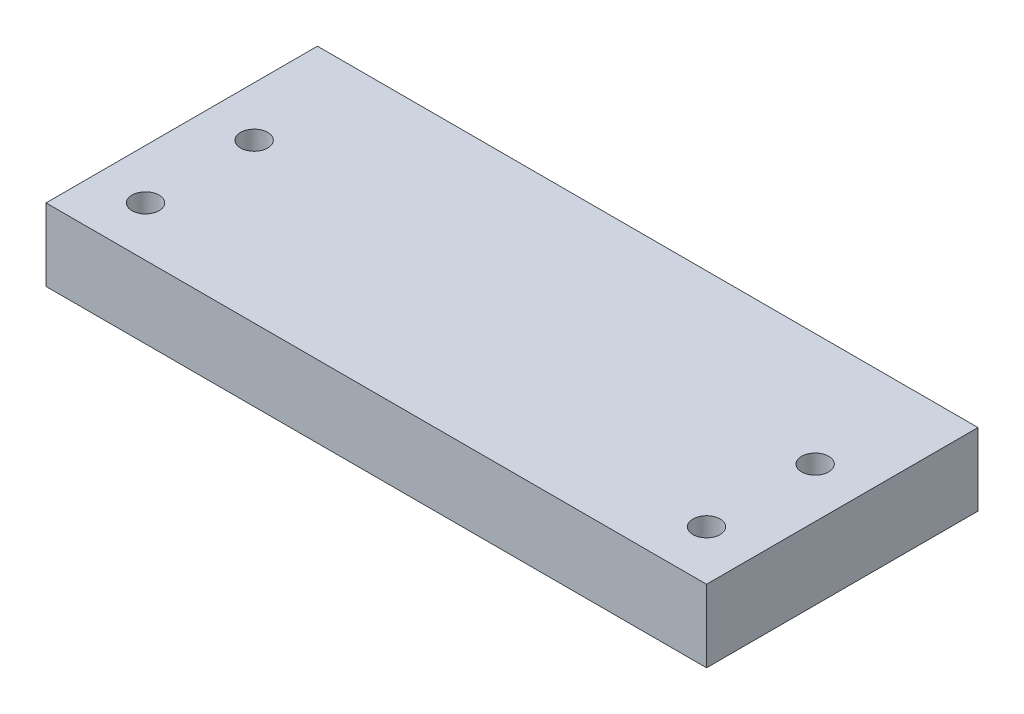
ISO-10303-21;
HEADER;
FILE_DESCRIPTION(('STEP AP214'),'2;1');
FILE_NAME('part.step','',(''),(''),'','','');
FILE_SCHEMA(('AUTOMOTIVE_DESIGN { 1 0 10303 214 1 1 1 1 }'));
ENDSEC;
DATA;
#1=APPLICATION_CONTEXT('core data for automotive mechanical design processes');
#2=APPLICATION_PROTOCOL_DEFINITION('international standard','automotive_design',2000,#1);
#3=PRODUCT_CONTEXT('',#1,'mechanical');
#4=PRODUCT('Part','Part','',(#3));
#5=PRODUCT_RELATED_PRODUCT_CATEGORY('part','',(#4));
#6=PRODUCT_DEFINITION_FORMATION('','',#4);
#7=PRODUCT_DEFINITION_CONTEXT('part definition',#1,'design');
#8=PRODUCT_DEFINITION('design','',#6,#7);
#9=PRODUCT_DEFINITION_SHAPE('','',#8);
#10=(LENGTH_UNIT() NAMED_UNIT(*) SI_UNIT(.MILLI.,.METRE.));
#11=(NAMED_UNIT(*) PLANE_ANGLE_UNIT() SI_UNIT($,.RADIAN.));
#12=(NAMED_UNIT(*) SI_UNIT($,.STERADIAN.) SOLID_ANGLE_UNIT());
#13=UNCERTAINTY_MEASURE_WITH_UNIT(LENGTH_MEASURE(1.E-05),#10,'distance_accuracy_value','');
#14=(GEOMETRIC_REPRESENTATION_CONTEXT(3) GLOBAL_UNCERTAINTY_ASSIGNED_CONTEXT((#13)) GLOBAL_UNIT_ASSIGNED_CONTEXT((#10,
#11,#12)) REPRESENTATION_CONTEXT('',''));
#15=CARTESIAN_POINT('',(0.,0.,0.));
#16=DIRECTION('',(0.,0.,1.));
#17=DIRECTION('',(1.,0.,0.));
#18=AXIS2_PLACEMENT_3D('',#15,#16,#17);
#19=CARTESIAN_POINT('',(36.5,8.,15.));
#20=DIRECTION('',(-1.,0.,0.));
#21=DIRECTION('',(0.,0.,1.));
#22=AXIS2_PLACEMENT_3D('',#19,#20,#21);
#23=PLANE('',#22);
#24=DIRECTION('',(0.,0.,-1.));
#25=VECTOR('',#24,1.);
#26=CARTESIAN_POINT('',(36.5,0.,15.));
#27=LINE('',#26,#25);
#28=CARTESIAN_POINT('',(36.5,0.,15.));
#29=VERTEX_POINT('',#28);
#30=CARTESIAN_POINT('',(36.5,0.,-15.));
#31=VERTEX_POINT('',#30);
#32=EDGE_CURVE('E100',#29,#31,#27,.T.);
#33=ORIENTED_EDGE('',*,*,#32,.T.);
#34=DIRECTION('',(0.,-1.,0.));
#35=VECTOR('',#34,1.);
#36=CARTESIAN_POINT('',(36.5,8.,-15.));
#37=LINE('',#36,#35);
#38=CARTESIAN_POINT('',(36.5,8.,-15.));
#39=VERTEX_POINT('',#38);
#40=EDGE_CURVE('E11',#39,#31,#37,.T.);
#41=ORIENTED_EDGE('',*,*,#40,.F.);
#42=DIRECTION('',(0.,0.,-1.));
#43=VECTOR('',#42,1.);
#44=CARTESIAN_POINT('',(36.5,8.,15.));
#45=LINE('',#44,#43);
#46=CARTESIAN_POINT('',(36.5,8.,15.));
#47=VERTEX_POINT('',#46);
#48=EDGE_CURVE('E87',#47,#39,#45,.T.);
#49=ORIENTED_EDGE('',*,*,#48,.F.);
#50=DIRECTION('',(0.,-1.,0.));
#51=VECTOR('',#50,1.);
#52=CARTESIAN_POINT('',(36.5,8.,15.));
#53=LINE('',#52,#51);
#54=EDGE_CURVE('E96',#47,#29,#53,.T.);
#55=ORIENTED_EDGE('',*,*,#54,.T.);
#56=EDGE_LOOP('',(#33,#41,#49,#55));
#57=FACE_BOUND('',#56,.T.);
#58=ADVANCED_FACE('F34',(#57),#23,.F.);
#59=CARTESIAN_POINT('',(-36.5,8.,-15.));
#60=DIRECTION('',(0.,0.,1.));
#61=DIRECTION('',(1.,0.,0.));
#62=AXIS2_PLACEMENT_3D('',#59,#60,#61);
#63=PLANE('',#62);
#64=DIRECTION('',(-1.,0.,0.));
#65=VECTOR('',#64,1.);
#66=CARTESIAN_POINT('',(-36.5,0.,-15.));
#67=LINE('',#66,#65);
#68=CARTESIAN_POINT('',(-36.5,0.,-15.));
#69=VERTEX_POINT('',#68);
#70=EDGE_CURVE('E91',#31,#69,#67,.T.);
#71=ORIENTED_EDGE('',*,*,#70,.T.);
#72=DIRECTION('',(0.,-1.,0.));
#73=VECTOR('',#72,1.);
#74=CARTESIAN_POINT('',(-36.5,8.,-15.));
#75=LINE('',#74,#73);
#76=CARTESIAN_POINT('',(-36.5,8.,-15.));
#77=VERTEX_POINT('',#76);
#78=EDGE_CURVE('E43',#77,#69,#75,.T.);
#79=ORIENTED_EDGE('',*,*,#78,.F.);
#80=DIRECTION('',(-1.,0.,0.));
#81=VECTOR('',#80,1.);
#82=CARTESIAN_POINT('',(-36.5,8.,-15.));
#83=LINE('',#82,#81);
#84=EDGE_CURVE('E82',#39,#77,#83,.T.);
#85=ORIENTED_EDGE('',*,*,#84,.F.);
#86=ORIENTED_EDGE('',*,*,#40,.T.);
#87=EDGE_LOOP('',(#71,#79,#85,#86));
#88=FACE_BOUND('',#87,.T.);
#89=ADVANCED_FACE('F90',(#88),#63,.F.);
#90=CARTESIAN_POINT('',(-36.5,8.,15.));
#91=DIRECTION('',(1.,0.,0.));
#92=DIRECTION('',(0.,0.,-1.));
#93=AXIS2_PLACEMENT_3D('',#90,#91,#92);
#94=PLANE('',#93);
#95=DIRECTION('',(0.,0.,1.));
#96=VECTOR('',#95,1.);
#97=CARTESIAN_POINT('',(-36.5,0.,15.));
#98=LINE('',#97,#96);
#99=CARTESIAN_POINT('',(-36.5,0.,15.));
#100=VERTEX_POINT('',#99);
#101=EDGE_CURVE('E69',#69,#100,#98,.T.);
#102=ORIENTED_EDGE('',*,*,#101,.T.);
#103=DIRECTION('',(0.,-1.,0.));
#104=VECTOR('',#103,1.);
#105=CARTESIAN_POINT('',(-36.5,8.,15.));
#106=LINE('',#105,#104);
#107=CARTESIAN_POINT('',(-36.5,8.,15.));
#108=VERTEX_POINT('',#107);
#109=EDGE_CURVE('E92',#108,#100,#106,.T.);
#110=ORIENTED_EDGE('',*,*,#109,.F.);
#111=DIRECTION('',(0.,0.,1.));
#112=VECTOR('',#111,1.);
#113=CARTESIAN_POINT('',(-36.5,8.,15.));
#114=LINE('',#113,#112);
#115=EDGE_CURVE('E85',#77,#108,#114,.T.);
#116=ORIENTED_EDGE('',*,*,#115,.F.);
#117=ORIENTED_EDGE('',*,*,#78,.T.);
#118=EDGE_LOOP('',(#102,#110,#116,#117));
#119=FACE_BOUND('',#118,.T.);
#120=ADVANCED_FACE('F94',(#119),#94,.F.);
#121=CARTESIAN_POINT('',(-36.5,8.,15.));
#122=DIRECTION('',(0.,0.,-1.));
#123=DIRECTION('',(-1.,0.,0.));
#124=AXIS2_PLACEMENT_3D('',#121,#122,#123);
#125=PLANE('',#124);
#126=DIRECTION('',(1.,0.,0.));
#127=VECTOR('',#126,1.);
#128=CARTESIAN_POINT('',(-36.5,0.,15.));
#129=LINE('',#128,#127);
#130=EDGE_CURVE('E75',#100,#29,#129,.T.);
#131=ORIENTED_EDGE('',*,*,#130,.T.);
#132=ORIENTED_EDGE('',*,*,#54,.F.);
#133=DIRECTION('',(1.,0.,0.));
#134=VECTOR('',#133,1.);
#135=CARTESIAN_POINT('',(-36.5,8.,15.));
#136=LINE('',#135,#134);
#137=EDGE_CURVE('E52',#108,#47,#136,.T.);
#138=ORIENTED_EDGE('',*,*,#137,.F.);
#139=ORIENTED_EDGE('',*,*,#109,.T.);
#140=EDGE_LOOP('',(#131,#132,#138,#139));
#141=FACE_BOUND('',#140,.T.);
#142=ADVANCED_FACE('F150',(#141),#125,.F.);
#143=CARTESIAN_POINT('',(0.,8.,0.));
#144=DIRECTION('',(0.,-1.,0.));
#145=DIRECTION('',(0.,0.,-1.));
#146=AXIS2_PLACEMENT_3D('',#143,#144,#145);
#147=PLANE('',#146);
#148=CARTESIAN_POINT('',(31.,8.,9.49999999999999));
#149=DIRECTION('',(0.,-1.,0.));
#150=DIRECTION('',(0.,0.,-1.));
#151=AXIS2_PLACEMENT_3D('',#148,#149,#150);
#152=CIRCLE('',#151,1.5);
#153=CARTESIAN_POINT('',(32.5,8.,9.49999999999999));
#154=VERTEX_POINT('',#153);
#155=EDGE_CURVE('E103',#154,#154,#152,.T.);
#156=ORIENTED_EDGE('',*,*,#155,.T.);
#157=EDGE_LOOP('',(#156));
#158=FACE_BOUND('',#157,.T.);
#159=CARTESIAN_POINT('',(-31.,8.,9.5));
#160=DIRECTION('',(0.,-1.,0.));
#161=DIRECTION('',(0.,0.,-1.));
#162=AXIS2_PLACEMENT_3D('',#159,#160,#161);
#163=CIRCLE('',#162,1.5);
#164=CARTESIAN_POINT('',(-29.5,8.,9.5));
#165=VERTEX_POINT('',#164);
#166=EDGE_CURVE('E118',#165,#165,#163,.T.);
#167=ORIENTED_EDGE('',*,*,#166,.T.);
#168=EDGE_LOOP('',(#167));
#169=FACE_BOUND('',#168,.T.);
#170=CARTESIAN_POINT('',(-31.,8.,-2.5));
#171=DIRECTION('',(0.,-1.,0.));
#172=DIRECTION('',(0.,0.,-1.));
#173=AXIS2_PLACEMENT_3D('',#170,#171,#172);
#174=CIRCLE('',#173,1.5);
#175=CARTESIAN_POINT('',(-29.5,8.,-2.5));
#176=VERTEX_POINT('',#175);
#177=EDGE_CURVE('E115',#176,#176,#174,.T.);
#178=ORIENTED_EDGE('',*,*,#177,.T.);
#179=EDGE_LOOP('',(#178));
#180=FACE_BOUND('',#179,.T.);
#181=CARTESIAN_POINT('',(31.,8.,-2.50000000000001));
#182=DIRECTION('',(0.,-1.,0.));
#183=DIRECTION('',(0.,0.,-1.));
#184=AXIS2_PLACEMENT_3D('',#181,#182,#183);
#185=CIRCLE('',#184,1.5);
#186=CARTESIAN_POINT('',(32.5,8.,-2.50000000000001));
#187=VERTEX_POINT('',#186);
#188=EDGE_CURVE('E112',#187,#187,#185,.T.);
#189=ORIENTED_EDGE('',*,*,#188,.T.);
#190=EDGE_LOOP('',(#189));
#191=FACE_BOUND('',#190,.T.);
#192=ORIENTED_EDGE('',*,*,#48,.T.);
#193=ORIENTED_EDGE('',*,*,#84,.T.);
#194=ORIENTED_EDGE('',*,*,#115,.T.);
#195=ORIENTED_EDGE('',*,*,#137,.T.);
#196=EDGE_LOOP('',(#192,#193,#194,#195));
#197=FACE_BOUND('',#196,.T.);
#198=ADVANCED_FACE('F83',(#158,#169,#180,#191,#197),#147,.F.);
#199=CARTESIAN_POINT('',(0.,0.,0.));
#200=DIRECTION('',(0.,-1.,0.));
#201=DIRECTION('',(0.,0.,-1.));
#202=AXIS2_PLACEMENT_3D('',#199,#200,#201);
#203=PLANE('',#202);
#204=CARTESIAN_POINT('',(31.,0.,9.49999999999999));
#205=DIRECTION('',(0.,-1.,0.));
#206=DIRECTION('',(0.,0.,-1.));
#207=AXIS2_PLACEMENT_3D('',#204,#205,#206);
#208=CIRCLE('',#207,1.5);
#209=CARTESIAN_POINT('',(32.5,0.,9.49999999999999));
#210=VERTEX_POINT('',#209);
#211=EDGE_CURVE('E37',#210,#210,#208,.T.);
#212=ORIENTED_EDGE('',*,*,#211,.F.);
#213=EDGE_LOOP('',(#212));
#214=FACE_BOUND('',#213,.T.);
#215=CARTESIAN_POINT('',(-31.,0.,9.5));
#216=DIRECTION('',(0.,-1.,0.));
#217=DIRECTION('',(0.,0.,-1.));
#218=AXIS2_PLACEMENT_3D('',#215,#216,#217);
#219=CIRCLE('',#218,1.5);
#220=CARTESIAN_POINT('',(-29.5,0.,9.5));
#221=VERTEX_POINT('',#220);
#222=EDGE_CURVE('E116',#221,#221,#219,.T.);
#223=ORIENTED_EDGE('',*,*,#222,.F.);
#224=EDGE_LOOP('',(#223));
#225=FACE_BOUND('',#224,.T.);
#226=CARTESIAN_POINT('',(-31.,0.,-2.5));
#227=DIRECTION('',(0.,-1.,0.));
#228=DIRECTION('',(0.,0.,-1.));
#229=AXIS2_PLACEMENT_3D('',#226,#227,#228);
#230=CIRCLE('',#229,1.5);
#231=CARTESIAN_POINT('',(-29.5,0.,-2.5));
#232=VERTEX_POINT('',#231);
#233=EDGE_CURVE('E113',#232,#232,#230,.T.);
#234=ORIENTED_EDGE('',*,*,#233,.F.);
#235=EDGE_LOOP('',(#234));
#236=FACE_BOUND('',#235,.T.);
#237=CARTESIAN_POINT('',(31.,0.,-2.50000000000001));
#238=DIRECTION('',(0.,-1.,0.));
#239=DIRECTION('',(0.,0.,-1.));
#240=AXIS2_PLACEMENT_3D('',#237,#238,#239);
#241=CIRCLE('',#240,1.5);
#242=CARTESIAN_POINT('',(32.5,0.,-2.50000000000001));
#243=VERTEX_POINT('',#242);
#244=EDGE_CURVE('E109',#243,#243,#241,.T.);
#245=ORIENTED_EDGE('',*,*,#244,.F.);
#246=EDGE_LOOP('',(#245));
#247=FACE_BOUND('',#246,.T.);
#248=ORIENTED_EDGE('',*,*,#32,.F.);
#249=ORIENTED_EDGE('',*,*,#130,.F.);
#250=ORIENTED_EDGE('',*,*,#101,.F.);
#251=ORIENTED_EDGE('',*,*,#70,.F.);
#252=EDGE_LOOP('',(#248,#249,#250,#251));
#253=FACE_BOUND('',#252,.T.);
#254=ADVANCED_FACE('F138',(#214,#225,#236,#247,#253),#203,.T.);
#255=CARTESIAN_POINT('',(31.,17.,-2.50000000000001));
#256=DIRECTION('',(0.,-1.,0.));
#257=DIRECTION('',(1.,0.,0.));
#258=AXIS2_PLACEMENT_3D('',#255,#256,#257);
#259=CYLINDRICAL_SURFACE('',#258,1.5);
#260=CARTESIAN_POINT('',(32.5,0.,-2.50000000000001));
#261=CARTESIAN_POINT('',(32.5,0.0833333333333368,-2.50000000000001));
#262=CARTESIAN_POINT('',(32.5,0.16666666666667,-2.50000000000001));
#263=CARTESIAN_POINT('',(32.5,0.333333333333337,-2.50000000000001));
#264=CARTESIAN_POINT('',(32.5,0.416666666666671,-2.50000000000001));
#265=CARTESIAN_POINT('',(32.5,0.583333333333337,-2.50000000000001));
#266=CARTESIAN_POINT('',(32.5,0.666666666666671,-2.50000000000001));
#267=CARTESIAN_POINT('',(32.5,0.833333333333338,-2.50000000000001));
#268=CARTESIAN_POINT('',(32.5,0.916666666666671,-2.50000000000001));
#269=CARTESIAN_POINT('',(32.5,1.08333333333334,-2.50000000000001));
#270=CARTESIAN_POINT('',(32.5,1.16666666666667,-2.50000000000001));
#271=CARTESIAN_POINT('',(32.5,1.33333333333334,-2.50000000000001));
#272=CARTESIAN_POINT('',(32.5,1.41666666666667,-2.50000000000001));
#273=CARTESIAN_POINT('',(32.5,1.58333333333333,-2.50000000000001));
#274=CARTESIAN_POINT('',(32.5,1.66666666666667,-2.50000000000001));
#275=CARTESIAN_POINT('',(32.5,1.83333333333334,-2.50000000000001));
#276=CARTESIAN_POINT('',(32.5,1.91666666666667,-2.50000000000001));
#277=CARTESIAN_POINT('',(32.5,2.08333333333334,-2.50000000000001));
#278=CARTESIAN_POINT('',(32.5,2.16666666666667,-2.50000000000001));
#279=CARTESIAN_POINT('',(32.5,2.33333333333334,-2.50000000000001));
#280=CARTESIAN_POINT('',(32.5,2.41666666666667,-2.50000000000001));
#281=CARTESIAN_POINT('',(32.5,2.58333333333334,-2.50000000000001));
#282=CARTESIAN_POINT('',(32.5,2.66666666666667,-2.50000000000001));
#283=CARTESIAN_POINT('',(32.5,2.83333333333333,-2.50000000000001));
#284=CARTESIAN_POINT('',(32.5,2.91666666666667,-2.50000000000001));
#285=CARTESIAN_POINT('',(32.5,3.08333333333333,-2.50000000000001));
#286=CARTESIAN_POINT('',(32.5,3.16666666666667,-2.50000000000001));
#287=CARTESIAN_POINT('',(32.5,3.33333333333333,-2.50000000000001));
#288=CARTESIAN_POINT('',(32.5,3.41666666666667,-2.50000000000001));
#289=CARTESIAN_POINT('',(32.5,3.58333333333333,-2.50000000000001));
#290=CARTESIAN_POINT('',(32.5,3.66666666666667,-2.50000000000001));
#291=CARTESIAN_POINT('',(32.5,3.83333333333333,-2.50000000000001));
#292=CARTESIAN_POINT('',(32.5,3.91666666666667,-2.50000000000001));
#293=CARTESIAN_POINT('',(32.5,4.08333333333334,-2.50000000000001));
#294=CARTESIAN_POINT('',(32.5,4.16666666666667,-2.50000000000001));
#295=CARTESIAN_POINT('',(32.5,4.33333333333334,-2.50000000000001));
#296=CARTESIAN_POINT('',(32.5,4.41666666666667,-2.50000000000001));
#297=CARTESIAN_POINT('',(32.5,4.58333333333334,-2.50000000000001));
#298=CARTESIAN_POINT('',(32.5,4.66666666666667,-2.50000000000001));
#299=CARTESIAN_POINT('',(32.5,4.83333333333334,-2.50000000000001));
#300=CARTESIAN_POINT('',(32.5,4.91666666666667,-2.50000000000001));
#301=CARTESIAN_POINT('',(32.5,5.08333333333334,-2.50000000000001));
#302=CARTESIAN_POINT('',(32.5,5.16666666666667,-2.50000000000001));
#303=CARTESIAN_POINT('',(32.5,5.33333333333334,-2.50000000000001));
#304=CARTESIAN_POINT('',(32.5,5.41666666666667,-2.50000000000001));
#305=CARTESIAN_POINT('',(32.5,5.58333333333333,-2.50000000000001));
#306=CARTESIAN_POINT('',(32.5,5.66666666666667,-2.50000000000001));
#307=CARTESIAN_POINT('',(32.5,5.83333333333334,-2.50000000000001));
#308=CARTESIAN_POINT('',(32.5,5.91666666666667,-2.50000000000001));
#309=CARTESIAN_POINT('',(32.5,6.08333333333334,-2.50000000000001));
#310=CARTESIAN_POINT('',(32.5,6.16666666666667,-2.50000000000001));
#311=CARTESIAN_POINT('',(32.5,6.33333333333334,-2.50000000000001));
#312=CARTESIAN_POINT('',(32.5,6.41666666666667,-2.50000000000001));
#313=CARTESIAN_POINT('',(32.5,6.58333333333333,-2.50000000000001));
#314=CARTESIAN_POINT('',(32.5,6.66666666666667,-2.50000000000001));
#315=CARTESIAN_POINT('',(32.5,6.83333333333333,-2.50000000000001));
#316=CARTESIAN_POINT('',(32.5,6.91666666666667,-2.50000000000001));
#317=CARTESIAN_POINT('',(32.5,7.08333333333333,-2.50000000000001));
#318=CARTESIAN_POINT('',(32.5,7.16666666666667,-2.50000000000001));
#319=CARTESIAN_POINT('',(32.5,7.33333333333333,-2.50000000000001));
#320=CARTESIAN_POINT('',(32.5,7.41666666666667,-2.50000000000001));
#321=CARTESIAN_POINT('',(32.5,7.58333333333333,-2.50000000000001));
#322=CARTESIAN_POINT('',(32.5,7.66666666666667,-2.50000000000001));
#323=CARTESIAN_POINT('',(32.5,7.83333333333333,-2.50000000000001));
#324=CARTESIAN_POINT('',(32.5,7.91666666666667,-2.50000000000001));
#325=CARTESIAN_POINT('',(32.5,8.,-2.50000000000001));
#326=B_SPLINE_CURVE_WITH_KNOTS('',3,(#260,#261,#262,#263,#264,#265,#266,#267,#268,#269,#270,
#271,#272,#273,#274,#275,#276,#277,#278,#279,#280,#281,#282,#283,#284,#285,#286,#287,#288,#289,
#290,#291,#292,#293,#294,#295,#296,#297,#298,#299,#300,#301,#302,#303,#304,#305,#306,#307,#308,
#309,#310,#311,#312,#313,#314,#315,#316,#317,#318,#319,#320,#321,#322,#323,#324,#325),
.UNSPECIFIED.,.F.,.F.,(4,2,2,2,2,2,2,2,2,2,2,2,2,2,2,2,2,2,2,2,2,2,2,2,2,2,2,2,2,2,2,2,4),(0.,
0.25,0.5,0.750000000000001,1.,1.25,1.5,1.75,2.,2.25,2.5,2.75,3.,3.25,3.5,3.75,4.,4.25,4.5,4.75,
5.,5.25,5.5,5.75,6.,6.25,6.5,6.75,7.,7.25,7.5,7.75,8.),.UNSPECIFIED.);
#327=EDGE_CURVE('BSEAM141',#243,#187,#326,.T.);
#328=ORIENTED_EDGE('',*,*,#244,.T.);
#329=ORIENTED_EDGE('',*,*,#188,.F.);
#330=ORIENTED_EDGE('',*,*,#327,.T.);
#331=ORIENTED_EDGE('',*,*,#327,.F.);
#332=EDGE_LOOP('',(#328,#330,#329,#331));
#333=FACE_BOUND('',#332,.T.);
#334=ADVANCED_FACE('F141',(#333),#259,.F.);
#335=CARTESIAN_POINT('',(-31.,17.,-2.5));
#336=DIRECTION('',(0.,-1.,0.));
#337=DIRECTION('',(1.,0.,0.));
#338=AXIS2_PLACEMENT_3D('',#335,#336,#337);
#339=CYLINDRICAL_SURFACE('',#338,1.5);
#340=CARTESIAN_POINT('',(-29.5,0.,-2.5));
#341=CARTESIAN_POINT('',(-29.5,0.0833333333333368,-2.5));
#342=CARTESIAN_POINT('',(-29.5,0.16666666666667,-2.5));
#343=CARTESIAN_POINT('',(-29.5,0.333333333333337,-2.5));
#344=CARTESIAN_POINT('',(-29.5,0.416666666666671,-2.5));
#345=CARTESIAN_POINT('',(-29.5,0.583333333333337,-2.5));
#346=CARTESIAN_POINT('',(-29.5,0.666666666666671,-2.5));
#347=CARTESIAN_POINT('',(-29.5,0.833333333333338,-2.5));
#348=CARTESIAN_POINT('',(-29.5,0.916666666666671,-2.5));
#349=CARTESIAN_POINT('',(-29.5,1.08333333333334,-2.5));
#350=CARTESIAN_POINT('',(-29.5,1.16666666666667,-2.5));
#351=CARTESIAN_POINT('',(-29.5,1.33333333333334,-2.5));
#352=CARTESIAN_POINT('',(-29.5,1.41666666666667,-2.5));
#353=CARTESIAN_POINT('',(-29.5,1.58333333333333,-2.5));
#354=CARTESIAN_POINT('',(-29.5,1.66666666666667,-2.5));
#355=CARTESIAN_POINT('',(-29.5,1.83333333333334,-2.5));
#356=CARTESIAN_POINT('',(-29.5,1.91666666666667,-2.5));
#357=CARTESIAN_POINT('',(-29.5,2.08333333333334,-2.5));
#358=CARTESIAN_POINT('',(-29.5,2.16666666666667,-2.5));
#359=CARTESIAN_POINT('',(-29.5,2.33333333333334,-2.5));
#360=CARTESIAN_POINT('',(-29.5,2.41666666666667,-2.5));
#361=CARTESIAN_POINT('',(-29.5,2.58333333333334,-2.5));
#362=CARTESIAN_POINT('',(-29.5,2.66666666666667,-2.5));
#363=CARTESIAN_POINT('',(-29.5,2.83333333333333,-2.5));
#364=CARTESIAN_POINT('',(-29.5,2.91666666666667,-2.5));
#365=CARTESIAN_POINT('',(-29.5,3.08333333333333,-2.5));
#366=CARTESIAN_POINT('',(-29.5,3.16666666666667,-2.5));
#367=CARTESIAN_POINT('',(-29.5,3.33333333333333,-2.5));
#368=CARTESIAN_POINT('',(-29.5,3.41666666666667,-2.5));
#369=CARTESIAN_POINT('',(-29.5,3.58333333333333,-2.5));
#370=CARTESIAN_POINT('',(-29.5,3.66666666666667,-2.5));
#371=CARTESIAN_POINT('',(-29.5,3.83333333333333,-2.5));
#372=CARTESIAN_POINT('',(-29.5,3.91666666666667,-2.5));
#373=CARTESIAN_POINT('',(-29.5,4.08333333333334,-2.5));
#374=CARTESIAN_POINT('',(-29.5,4.16666666666667,-2.5));
#375=CARTESIAN_POINT('',(-29.5,4.33333333333334,-2.5));
#376=CARTESIAN_POINT('',(-29.5,4.41666666666667,-2.5));
#377=CARTESIAN_POINT('',(-29.5,4.58333333333334,-2.5));
#378=CARTESIAN_POINT('',(-29.5,4.66666666666667,-2.5));
#379=CARTESIAN_POINT('',(-29.5,4.83333333333334,-2.5));
#380=CARTESIAN_POINT('',(-29.5,4.91666666666667,-2.5));
#381=CARTESIAN_POINT('',(-29.5,5.08333333333334,-2.5));
#382=CARTESIAN_POINT('',(-29.5,5.16666666666667,-2.5));
#383=CARTESIAN_POINT('',(-29.5,5.33333333333334,-2.5));
#384=CARTESIAN_POINT('',(-29.5,5.41666666666667,-2.5));
#385=CARTESIAN_POINT('',(-29.5,5.58333333333333,-2.5));
#386=CARTESIAN_POINT('',(-29.5,5.66666666666667,-2.5));
#387=CARTESIAN_POINT('',(-29.5,5.83333333333334,-2.5));
#388=CARTESIAN_POINT('',(-29.5,5.91666666666667,-2.5));
#389=CARTESIAN_POINT('',(-29.5,6.08333333333334,-2.5));
#390=CARTESIAN_POINT('',(-29.5,6.16666666666667,-2.5));
#391=CARTESIAN_POINT('',(-29.5,6.33333333333334,-2.5));
#392=CARTESIAN_POINT('',(-29.5,6.41666666666667,-2.5));
#393=CARTESIAN_POINT('',(-29.5,6.58333333333333,-2.5));
#394=CARTESIAN_POINT('',(-29.5,6.66666666666667,-2.5));
#395=CARTESIAN_POINT('',(-29.5,6.83333333333333,-2.5));
#396=CARTESIAN_POINT('',(-29.5,6.91666666666667,-2.5));
#397=CARTESIAN_POINT('',(-29.5,7.08333333333333,-2.5));
#398=CARTESIAN_POINT('',(-29.5,7.16666666666667,-2.5));
#399=CARTESIAN_POINT('',(-29.5,7.33333333333333,-2.5));
#400=CARTESIAN_POINT('',(-29.5,7.41666666666667,-2.5));
#401=CARTESIAN_POINT('',(-29.5,7.58333333333333,-2.5));
#402=CARTESIAN_POINT('',(-29.5,7.66666666666667,-2.5));
#403=CARTESIAN_POINT('',(-29.5,7.83333333333333,-2.5));
#404=CARTESIAN_POINT('',(-29.5,7.91666666666667,-2.5));
#405=CARTESIAN_POINT('',(-29.5,8.,-2.5));
#406=B_SPLINE_CURVE_WITH_KNOTS('',3,(#340,#341,#342,#343,#344,#345,#346,#347,#348,#349,#350,
#351,#352,#353,#354,#355,#356,#357,#358,#359,#360,#361,#362,#363,#364,#365,#366,#367,#368,#369,
#370,#371,#372,#373,#374,#375,#376,#377,#378,#379,#380,#381,#382,#383,#384,#385,#386,#387,#388,
#389,#390,#391,#392,#393,#394,#395,#396,#397,#398,#399,#400,#401,#402,#403,#404,#405),
.UNSPECIFIED.,.F.,.F.,(4,2,2,2,2,2,2,2,2,2,2,2,2,2,2,2,2,2,2,2,2,2,2,2,2,2,2,2,2,2,2,2,4),(0.,
0.25,0.5,0.750000000000001,1.,1.25,1.5,1.75,2.,2.25,2.5,2.75,3.,3.25,3.5,3.75,4.,4.25,4.5,4.75,
5.,5.25,5.5,5.75,6.,6.25,6.5,6.75,7.,7.25,7.5,7.75,8.),.UNSPECIFIED.);
#407=EDGE_CURVE('BSEAM194',#232,#176,#406,.T.);
#408=ORIENTED_EDGE('',*,*,#233,.T.);
#409=ORIENTED_EDGE('',*,*,#177,.F.);
#410=ORIENTED_EDGE('',*,*,#407,.T.);
#411=ORIENTED_EDGE('',*,*,#407,.F.);
#412=EDGE_LOOP('',(#408,#410,#409,#411));
#413=FACE_BOUND('',#412,.T.);
#414=ADVANCED_FACE('F194',(#413),#339,.F.);
#415=CARTESIAN_POINT('',(-31.,17.,9.5));
#416=DIRECTION('',(0.,-1.,0.));
#417=DIRECTION('',(1.,0.,0.));
#418=AXIS2_PLACEMENT_3D('',#415,#416,#417);
#419=CYLINDRICAL_SURFACE('',#418,1.5);
#420=CARTESIAN_POINT('',(-29.5,0.,9.5));
#421=CARTESIAN_POINT('',(-29.5,0.0833333333333368,9.5));
#422=CARTESIAN_POINT('',(-29.5,0.16666666666667,9.5));
#423=CARTESIAN_POINT('',(-29.5,0.333333333333337,9.5));
#424=CARTESIAN_POINT('',(-29.5,0.416666666666671,9.5));
#425=CARTESIAN_POINT('',(-29.5,0.583333333333337,9.5));
#426=CARTESIAN_POINT('',(-29.5,0.666666666666671,9.5));
#427=CARTESIAN_POINT('',(-29.5,0.833333333333338,9.5));
#428=CARTESIAN_POINT('',(-29.5,0.916666666666671,9.5));
#429=CARTESIAN_POINT('',(-29.5,1.08333333333334,9.5));
#430=CARTESIAN_POINT('',(-29.5,1.16666666666667,9.5));
#431=CARTESIAN_POINT('',(-29.5,1.33333333333334,9.5));
#432=CARTESIAN_POINT('',(-29.5,1.41666666666667,9.5));
#433=CARTESIAN_POINT('',(-29.5,1.58333333333333,9.5));
#434=CARTESIAN_POINT('',(-29.5,1.66666666666667,9.5));
#435=CARTESIAN_POINT('',(-29.5,1.83333333333334,9.5));
#436=CARTESIAN_POINT('',(-29.5,1.91666666666667,9.5));
#437=CARTESIAN_POINT('',(-29.5,2.08333333333334,9.5));
#438=CARTESIAN_POINT('',(-29.5,2.16666666666667,9.5));
#439=CARTESIAN_POINT('',(-29.5,2.33333333333334,9.5));
#440=CARTESIAN_POINT('',(-29.5,2.41666666666667,9.5));
#441=CARTESIAN_POINT('',(-29.5,2.58333333333334,9.5));
#442=CARTESIAN_POINT('',(-29.5,2.66666666666667,9.5));
#443=CARTESIAN_POINT('',(-29.5,2.83333333333333,9.5));
#444=CARTESIAN_POINT('',(-29.5,2.91666666666667,9.5));
#445=CARTESIAN_POINT('',(-29.5,3.08333333333333,9.5));
#446=CARTESIAN_POINT('',(-29.5,3.16666666666667,9.5));
#447=CARTESIAN_POINT('',(-29.5,3.33333333333333,9.5));
#448=CARTESIAN_POINT('',(-29.5,3.41666666666667,9.5));
#449=CARTESIAN_POINT('',(-29.5,3.58333333333333,9.5));
#450=CARTESIAN_POINT('',(-29.5,3.66666666666667,9.5));
#451=CARTESIAN_POINT('',(-29.5,3.83333333333333,9.5));
#452=CARTESIAN_POINT('',(-29.5,3.91666666666667,9.5));
#453=CARTESIAN_POINT('',(-29.5,4.08333333333334,9.5));
#454=CARTESIAN_POINT('',(-29.5,4.16666666666667,9.5));
#455=CARTESIAN_POINT('',(-29.5,4.33333333333334,9.5));
#456=CARTESIAN_POINT('',(-29.5,4.41666666666667,9.5));
#457=CARTESIAN_POINT('',(-29.5,4.58333333333334,9.5));
#458=CARTESIAN_POINT('',(-29.5,4.66666666666667,9.5));
#459=CARTESIAN_POINT('',(-29.5,4.83333333333334,9.5));
#460=CARTESIAN_POINT('',(-29.5,4.91666666666667,9.5));
#461=CARTESIAN_POINT('',(-29.5,5.08333333333334,9.5));
#462=CARTESIAN_POINT('',(-29.5,5.16666666666667,9.5));
#463=CARTESIAN_POINT('',(-29.5,5.33333333333334,9.5));
#464=CARTESIAN_POINT('',(-29.5,5.41666666666667,9.5));
#465=CARTESIAN_POINT('',(-29.5,5.58333333333333,9.5));
#466=CARTESIAN_POINT('',(-29.5,5.66666666666667,9.5));
#467=CARTESIAN_POINT('',(-29.5,5.83333333333334,9.5));
#468=CARTESIAN_POINT('',(-29.5,5.91666666666667,9.5));
#469=CARTESIAN_POINT('',(-29.5,6.08333333333334,9.5));
#470=CARTESIAN_POINT('',(-29.5,6.16666666666667,9.5));
#471=CARTESIAN_POINT('',(-29.5,6.33333333333334,9.5));
#472=CARTESIAN_POINT('',(-29.5,6.41666666666667,9.5));
#473=CARTESIAN_POINT('',(-29.5,6.58333333333333,9.5));
#474=CARTESIAN_POINT('',(-29.5,6.66666666666667,9.5));
#475=CARTESIAN_POINT('',(-29.5,6.83333333333333,9.5));
#476=CARTESIAN_POINT('',(-29.5,6.91666666666667,9.5));
#477=CARTESIAN_POINT('',(-29.5,7.08333333333333,9.5));
#478=CARTESIAN_POINT('',(-29.5,7.16666666666667,9.5));
#479=CARTESIAN_POINT('',(-29.5,7.33333333333333,9.5));
#480=CARTESIAN_POINT('',(-29.5,7.41666666666667,9.5));
#481=CARTESIAN_POINT('',(-29.5,7.58333333333333,9.5));
#482=CARTESIAN_POINT('',(-29.5,7.66666666666667,9.5));
#483=CARTESIAN_POINT('',(-29.5,7.83333333333333,9.5));
#484=CARTESIAN_POINT('',(-29.5,7.91666666666667,9.5));
#485=CARTESIAN_POINT('',(-29.5,8.,9.5));
#486=B_SPLINE_CURVE_WITH_KNOTS('',3,(#420,#421,#422,#423,#424,#425,#426,#427,#428,#429,#430,
#431,#432,#433,#434,#435,#436,#437,#438,#439,#440,#441,#442,#443,#444,#445,#446,#447,#448,#449,
#450,#451,#452,#453,#454,#455,#456,#457,#458,#459,#460,#461,#462,#463,#464,#465,#466,#467,#468,
#469,#470,#471,#472,#473,#474,#475,#476,#477,#478,#479,#480,#481,#482,#483,#484,#485),
.UNSPECIFIED.,.F.,.F.,(4,2,2,2,2,2,2,2,2,2,2,2,2,2,2,2,2,2,2,2,2,2,2,2,2,2,2,2,2,2,2,2,4),(0.,
0.25,0.5,0.750000000000001,1.,1.25,1.5,1.75,2.,2.25,2.5,2.75,3.,3.25,3.5,3.75,4.,4.25,4.5,4.75,
5.,5.25,5.5,5.75,6.,6.25,6.5,6.75,7.,7.25,7.5,7.75,8.),.UNSPECIFIED.);
#487=EDGE_CURVE('BSEAM204',#221,#165,#486,.T.);
#488=ORIENTED_EDGE('',*,*,#222,.T.);
#489=ORIENTED_EDGE('',*,*,#166,.F.);
#490=ORIENTED_EDGE('',*,*,#487,.T.);
#491=ORIENTED_EDGE('',*,*,#487,.F.);
#492=EDGE_LOOP('',(#488,#490,#489,#491));
#493=FACE_BOUND('',#492,.T.);
#494=ADVANCED_FACE('F204',(#493),#419,.F.);
#495=CARTESIAN_POINT('',(31.,17.,9.49999999999999));
#496=DIRECTION('',(0.,-1.,0.));
#497=DIRECTION('',(1.,0.,0.));
#498=AXIS2_PLACEMENT_3D('',#495,#496,#497);
#499=CYLINDRICAL_SURFACE('',#498,1.5);
#500=CARTESIAN_POINT('',(32.5,0.,9.49999999999999));
#501=CARTESIAN_POINT('',(32.5,0.0833333333333368,9.49999999999999));
#502=CARTESIAN_POINT('',(32.5,0.16666666666667,9.49999999999999));
#503=CARTESIAN_POINT('',(32.5,0.333333333333337,9.49999999999999));
#504=CARTESIAN_POINT('',(32.5,0.416666666666671,9.49999999999999));
#505=CARTESIAN_POINT('',(32.5,0.583333333333337,9.49999999999999));
#506=CARTESIAN_POINT('',(32.5,0.666666666666671,9.49999999999999));
#507=CARTESIAN_POINT('',(32.5,0.833333333333338,9.49999999999999));
#508=CARTESIAN_POINT('',(32.5,0.916666666666671,9.49999999999999));
#509=CARTESIAN_POINT('',(32.5,1.08333333333334,9.49999999999999));
#510=CARTESIAN_POINT('',(32.5,1.16666666666667,9.49999999999999));
#511=CARTESIAN_POINT('',(32.5,1.33333333333334,9.49999999999999));
#512=CARTESIAN_POINT('',(32.5,1.41666666666667,9.49999999999999));
#513=CARTESIAN_POINT('',(32.5,1.58333333333333,9.49999999999999));
#514=CARTESIAN_POINT('',(32.5,1.66666666666667,9.49999999999999));
#515=CARTESIAN_POINT('',(32.5,1.83333333333334,9.49999999999999));
#516=CARTESIAN_POINT('',(32.5,1.91666666666667,9.49999999999999));
#517=CARTESIAN_POINT('',(32.5,2.08333333333334,9.49999999999999));
#518=CARTESIAN_POINT('',(32.5,2.16666666666667,9.49999999999999));
#519=CARTESIAN_POINT('',(32.5,2.33333333333334,9.49999999999999));
#520=CARTESIAN_POINT('',(32.5,2.41666666666667,9.49999999999999));
#521=CARTESIAN_POINT('',(32.5,2.58333333333334,9.49999999999999));
#522=CARTESIAN_POINT('',(32.5,2.66666666666667,9.49999999999999));
#523=CARTESIAN_POINT('',(32.5,2.83333333333333,9.49999999999999));
#524=CARTESIAN_POINT('',(32.5,2.91666666666667,9.49999999999999));
#525=CARTESIAN_POINT('',(32.5,3.08333333333333,9.49999999999999));
#526=CARTESIAN_POINT('',(32.5,3.16666666666667,9.49999999999999));
#527=CARTESIAN_POINT('',(32.5,3.33333333333333,9.49999999999999));
#528=CARTESIAN_POINT('',(32.5,3.41666666666667,9.49999999999999));
#529=CARTESIAN_POINT('',(32.5,3.58333333333333,9.49999999999999));
#530=CARTESIAN_POINT('',(32.5,3.66666666666667,9.49999999999999));
#531=CARTESIAN_POINT('',(32.5,3.83333333333333,9.49999999999999));
#532=CARTESIAN_POINT('',(32.5,3.91666666666667,9.49999999999999));
#533=CARTESIAN_POINT('',(32.5,4.08333333333334,9.49999999999999));
#534=CARTESIAN_POINT('',(32.5,4.16666666666667,9.49999999999999));
#535=CARTESIAN_POINT('',(32.5,4.33333333333334,9.49999999999999));
#536=CARTESIAN_POINT('',(32.5,4.41666666666667,9.49999999999999));
#537=CARTESIAN_POINT('',(32.5,4.58333333333334,9.49999999999999));
#538=CARTESIAN_POINT('',(32.5,4.66666666666667,9.49999999999999));
#539=CARTESIAN_POINT('',(32.5,4.83333333333334,9.49999999999999));
#540=CARTESIAN_POINT('',(32.5,4.91666666666667,9.49999999999999));
#541=CARTESIAN_POINT('',(32.5,5.08333333333334,9.49999999999999));
#542=CARTESIAN_POINT('',(32.5,5.16666666666667,9.49999999999999));
#543=CARTESIAN_POINT('',(32.5,5.33333333333334,9.49999999999999));
#544=CARTESIAN_POINT('',(32.5,5.41666666666667,9.49999999999999));
#545=CARTESIAN_POINT('',(32.5,5.58333333333333,9.49999999999999));
#546=CARTESIAN_POINT('',(32.5,5.66666666666667,9.49999999999999));
#547=CARTESIAN_POINT('',(32.5,5.83333333333334,9.49999999999999));
#548=CARTESIAN_POINT('',(32.5,5.91666666666667,9.49999999999999));
#549=CARTESIAN_POINT('',(32.5,6.08333333333334,9.49999999999999));
#550=CARTESIAN_POINT('',(32.5,6.16666666666667,9.49999999999999));
#551=CARTESIAN_POINT('',(32.5,6.33333333333334,9.49999999999999));
#552=CARTESIAN_POINT('',(32.5,6.41666666666667,9.49999999999999));
#553=CARTESIAN_POINT('',(32.5,6.58333333333333,9.49999999999999));
#554=CARTESIAN_POINT('',(32.5,6.66666666666667,9.49999999999999));
#555=CARTESIAN_POINT('',(32.5,6.83333333333333,9.49999999999999));
#556=CARTESIAN_POINT('',(32.5,6.91666666666667,9.49999999999999));
#557=CARTESIAN_POINT('',(32.5,7.08333333333333,9.49999999999999));
#558=CARTESIAN_POINT('',(32.5,7.16666666666667,9.49999999999999));
#559=CARTESIAN_POINT('',(32.5,7.33333333333333,9.49999999999999));
#560=CARTESIAN_POINT('',(32.5,7.41666666666667,9.49999999999999));
#561=CARTESIAN_POINT('',(32.5,7.58333333333333,9.49999999999999));
#562=CARTESIAN_POINT('',(32.5,7.66666666666667,9.49999999999999));
#563=CARTESIAN_POINT('',(32.5,7.83333333333333,9.49999999999999));
#564=CARTESIAN_POINT('',(32.5,7.91666666666667,9.49999999999999));
#565=CARTESIAN_POINT('',(32.5,8.,9.49999999999999));
#566=B_SPLINE_CURVE_WITH_KNOTS('',3,(#500,#501,#502,#503,#504,#505,#506,#507,#508,#509,#510,
#511,#512,#513,#514,#515,#516,#517,#518,#519,#520,#521,#522,#523,#524,#525,#526,#527,#528,#529,
#530,#531,#532,#533,#534,#535,#536,#537,#538,#539,#540,#541,#542,#543,#544,#545,#546,#547,#548,
#549,#550,#551,#552,#553,#554,#555,#556,#557,#558,#559,#560,#561,#562,#563,#564,#565),
.UNSPECIFIED.,.F.,.F.,(4,2,2,2,2,2,2,2,2,2,2,2,2,2,2,2,2,2,2,2,2,2,2,2,2,2,2,2,2,2,2,2,4),(0.,
0.25,0.5,0.750000000000001,1.,1.25,1.5,1.75,2.,2.25,2.5,2.75,3.,3.25,3.5,3.75,4.,4.25,4.5,4.75,
5.,5.25,5.5,5.75,6.,6.25,6.5,6.75,7.,7.25,7.5,7.75,8.),.UNSPECIFIED.);
#567=EDGE_CURVE('BSEAM135',#210,#154,#566,.T.);
#568=ORIENTED_EDGE('',*,*,#211,.T.);
#569=ORIENTED_EDGE('',*,*,#155,.F.);
#570=ORIENTED_EDGE('',*,*,#567,.T.);
#571=ORIENTED_EDGE('',*,*,#567,.F.);
#572=EDGE_LOOP('',(#568,#570,#569,#571));
#573=FACE_BOUND('',#572,.T.);
#574=ADVANCED_FACE('F135',(#573),#499,.F.);
#575=CLOSED_SHELL('',(#58,#89,#120,#142,#198,#254,#334,#414,#494,#574));
#576=MANIFOLD_SOLID_BREP('B2',#575);
#577=ADVANCED_BREP_SHAPE_REPRESENTATION('',(#18,#576),#14);
#578=SHAPE_DEFINITION_REPRESENTATION(#9,#577);
ENDSEC;
END-ISO-10303-21;
